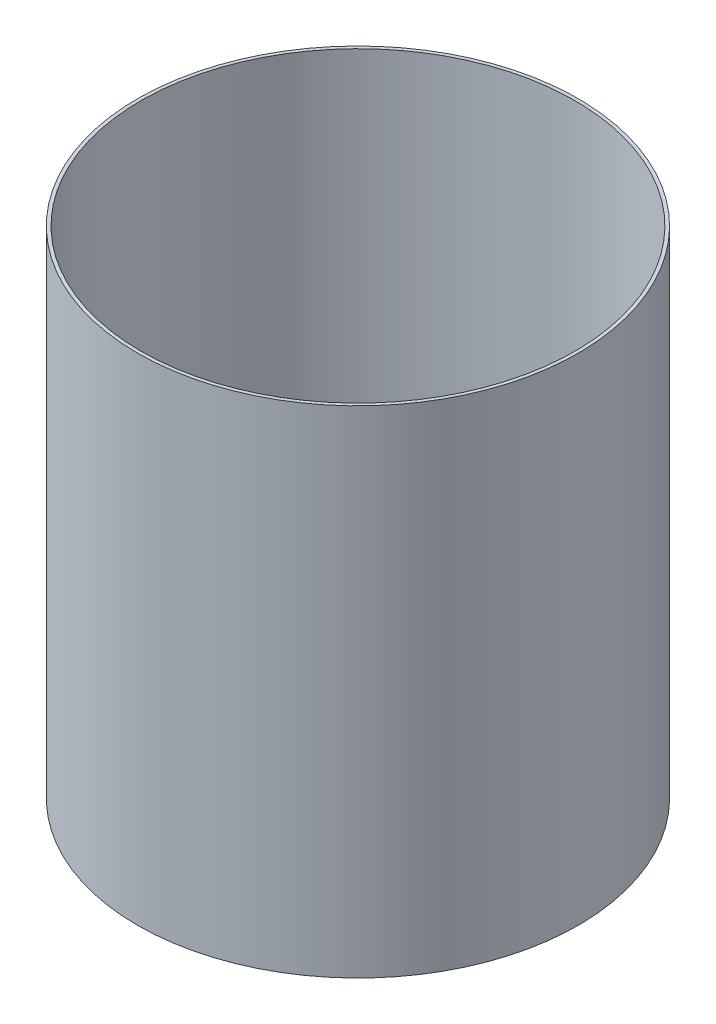
ISO-10303-21;
HEADER;
FILE_DESCRIPTION(('STEP AP214'),'2;1');
FILE_NAME('part.step','',(''),(''),'','','');
FILE_SCHEMA(('AUTOMOTIVE_DESIGN { 1 0 10303 214 1 1 1 1 }'));
ENDSEC;
DATA;
#1=APPLICATION_CONTEXT('core data for automotive mechanical design processes');
#2=APPLICATION_PROTOCOL_DEFINITION('international standard','automotive_design',2000,#1);
#3=PRODUCT_CONTEXT('',#1,'mechanical');
#4=PRODUCT('Part','Part','',(#3));
#5=PRODUCT_RELATED_PRODUCT_CATEGORY('part','',(#4));
#6=PRODUCT_DEFINITION_FORMATION('','',#4);
#7=PRODUCT_DEFINITION_CONTEXT('part definition',#1,'design');
#8=PRODUCT_DEFINITION('design','',#6,#7);
#9=PRODUCT_DEFINITION_SHAPE('','',#8);
#10=(LENGTH_UNIT() NAMED_UNIT(*) SI_UNIT(.MILLI.,.METRE.));
#11=(NAMED_UNIT(*) PLANE_ANGLE_UNIT() SI_UNIT($,.RADIAN.));
#12=(NAMED_UNIT(*) SI_UNIT($,.STERADIAN.) SOLID_ANGLE_UNIT());
#13=UNCERTAINTY_MEASURE_WITH_UNIT(LENGTH_MEASURE(1.E-05),#10,'distance_accuracy_value','');
#14=(GEOMETRIC_REPRESENTATION_CONTEXT(3) GLOBAL_UNCERTAINTY_ASSIGNED_CONTEXT((#13)) GLOBAL_UNIT_ASSIGNED_CONTEXT((#10,
#11,#12)) REPRESENTATION_CONTEXT('',''));
#15=CARTESIAN_POINT('',(0.,0.,0.));
#16=DIRECTION('',(0.,0.,1.));
#17=DIRECTION('',(1.,0.,0.));
#18=AXIS2_PLACEMENT_3D('',#15,#16,#17);
#19=CARTESIAN_POINT('',(0.,75.,0.));
#20=DIRECTION('',(0.,1.,0.));
#21=DIRECTION('',(0.,0.,1.));
#22=AXIS2_PLACEMENT_3D('',#19,#20,#21);
#23=PLANE('',#22);
#24=CARTESIAN_POINT('',(0.,75.,0.));
#25=DIRECTION('',(0.,1.,0.));
#26=DIRECTION('',(0.,0.,1.));
#27=AXIS2_PLACEMENT_3D('',#24,#25,#26);
#28=CIRCLE('',#27,66.7);
#29=CARTESIAN_POINT('',(0.,75.,66.7));
#30=VERTEX_POINT('',#29);
#31=EDGE_CURVE('E10',#30,#30,#28,.T.);
#32=ORIENTED_EDGE('',*,*,#31,.T.);
#33=EDGE_LOOP('',(#32));
#34=FACE_BOUND('',#33,.T.);
#35=CARTESIAN_POINT('',(0.,75.,0.));
#36=DIRECTION('',(0.,1.,0.));
#37=DIRECTION('',(0.,0.,1.));
#38=AXIS2_PLACEMENT_3D('',#35,#36,#37);
#39=CIRCLE('',#38,65.7);
#40=CARTESIAN_POINT('',(0.,75.,65.7));
#41=VERTEX_POINT('',#40);
#42=EDGE_CURVE('E46',#41,#41,#39,.T.);
#43=ORIENTED_EDGE('',*,*,#42,.F.);
#44=EDGE_LOOP('',(#43));
#45=FACE_BOUND('',#44,.T.);
#46=ADVANCED_FACE('F35',(#34,#45),#23,.T.);
#47=CARTESIAN_POINT('',(0.,-75.,0.));
#48=DIRECTION('',(0.,1.,0.));
#49=DIRECTION('',(0.,0.,1.));
#50=AXIS2_PLACEMENT_3D('',#47,#48,#49);
#51=PLANE('',#50);
#52=CARTESIAN_POINT('',(0.,-75.,0.));
#53=DIRECTION('',(0.,1.,0.));
#54=DIRECTION('',(0.,0.,1.));
#55=AXIS2_PLACEMENT_3D('',#52,#53,#54);
#56=CIRCLE('',#55,66.7);
#57=CARTESIAN_POINT('',(0.,-75.,66.7));
#58=VERTEX_POINT('',#57);
#59=EDGE_CURVE('E39',#58,#58,#56,.T.);
#60=ORIENTED_EDGE('',*,*,#59,.F.);
#61=EDGE_LOOP('',(#60));
#62=FACE_BOUND('',#61,.T.);
#63=CARTESIAN_POINT('',(0.,-75.,0.));
#64=DIRECTION('',(0.,1.,0.));
#65=DIRECTION('',(0.,0.,1.));
#66=AXIS2_PLACEMENT_3D('',#63,#64,#65);
#67=CIRCLE('',#66,65.7);
#68=CARTESIAN_POINT('',(0.,-75.,65.7));
#69=VERTEX_POINT('',#68);
#70=EDGE_CURVE('E48',#69,#69,#67,.T.);
#71=ORIENTED_EDGE('',*,*,#70,.T.);
#72=EDGE_LOOP('',(#71));
#73=FACE_BOUND('',#72,.T.);
#74=ADVANCED_FACE('F58',(#62,#73),#51,.F.);
#75=CARTESIAN_POINT('',(0.,75.,0.));
#76=DIRECTION('',(0.,-1.,0.));
#77=DIRECTION('',(0.,0.,-1.));
#78=AXIS2_PLACEMENT_3D('',#75,#76,#77);
#79=CYLINDRICAL_SURFACE('',#78,66.7);
#80=ORIENTED_EDGE('',*,*,#31,.F.);
#81=EDGE_LOOP('',(#80));
#82=FACE_BOUND('',#81,.T.);
#83=ORIENTED_EDGE('',*,*,#59,.T.);
#84=EDGE_LOOP('',(#83));
#85=FACE_BOUND('',#84,.T.);
#86=ADVANCED_FACE('F37',(#82,#85),#79,.T.);
#87=CARTESIAN_POINT('',(0.,75.,0.));
#88=DIRECTION('',(0.,-1.,0.));
#89=DIRECTION('',(0.,0.,-1.));
#90=AXIS2_PLACEMENT_3D('',#87,#88,#89);
#91=CYLINDRICAL_SURFACE('',#90,65.7);
#92=ORIENTED_EDGE('',*,*,#42,.T.);
#93=EDGE_LOOP('',(#92));
#94=FACE_BOUND('',#93,.T.);
#95=ORIENTED_EDGE('',*,*,#70,.F.);
#96=EDGE_LOOP('',(#95));
#97=FACE_BOUND('',#96,.T.);
#98=ADVANCED_FACE('F54',(#94,#97),#91,.F.);
#99=CLOSED_SHELL('',(#46,#74,#86,#98));
#100=MANIFOLD_SOLID_BREP('B2',#99);
#101=ADVANCED_BREP_SHAPE_REPRESENTATION('',(#18,#100),#14);
#102=SHAPE_DEFINITION_REPRESENTATION(#9,#101);
ENDSEC;
END-ISO-10303-21;
